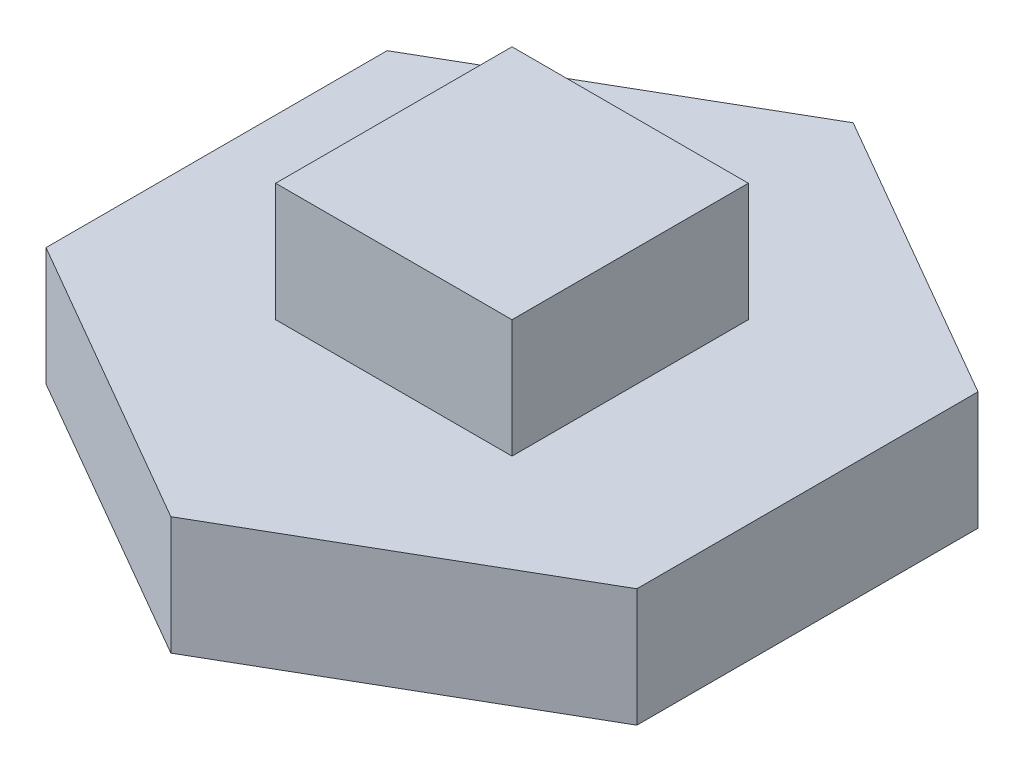
ISO-10303-21;
HEADER;
FILE_DESCRIPTION(('STEP AP214'),'2;1');
FILE_NAME('part.step','',(''),(''),'','','');
FILE_SCHEMA(('AUTOMOTIVE_DESIGN { 1 0 10303 214 1 1 1 1 }'));
ENDSEC;
DATA;
#1=APPLICATION_CONTEXT('core data for automotive mechanical design processes');
#2=APPLICATION_PROTOCOL_DEFINITION('international standard','automotive_design',2000,#1);
#3=PRODUCT_CONTEXT('',#1,'mechanical');
#4=PRODUCT('Part','Part','',(#3));
#5=PRODUCT_RELATED_PRODUCT_CATEGORY('part','',(#4));
#6=PRODUCT_DEFINITION_FORMATION('','',#4);
#7=PRODUCT_DEFINITION_CONTEXT('part definition',#1,'design');
#8=PRODUCT_DEFINITION('design','',#6,#7);
#9=PRODUCT_DEFINITION_SHAPE('','',#8);
#10=(LENGTH_UNIT() NAMED_UNIT(*) SI_UNIT(.MILLI.,.METRE.));
#11=(NAMED_UNIT(*) PLANE_ANGLE_UNIT() SI_UNIT($,.RADIAN.));
#12=(NAMED_UNIT(*) SI_UNIT($,.STERADIAN.) SOLID_ANGLE_UNIT());
#13=UNCERTAINTY_MEASURE_WITH_UNIT(LENGTH_MEASURE(1.E-05),#10,'distance_accuracy_value','');
#14=(GEOMETRIC_REPRESENTATION_CONTEXT(3) GLOBAL_UNCERTAINTY_ASSIGNED_CONTEXT((#13)) GLOBAL_UNIT_ASSIGNED_CONTEXT((#10,
#11,#12)) REPRESENTATION_CONTEXT('',''));
#15=CARTESIAN_POINT('',(0.,0.,0.));
#16=DIRECTION('',(0.,0.,1.));
#17=DIRECTION('',(1.,0.,0.));
#18=AXIS2_PLACEMENT_3D('',#15,#16,#17);
#19=CARTESIAN_POINT('',(25.0000000000003,10.,14.4337567297404));
#20=DIRECTION('',(-1.,0.,0.));
#21=DIRECTION('',(0.,0.,1.));
#22=AXIS2_PLACEMENT_3D('',#19,#20,#21);
#23=PLANE('',#22);
#24=DIRECTION('',(0.,0.,-1.));
#25=VECTOR('',#24,1.);
#26=CARTESIAN_POINT('',(25.0000000000003,0.,14.4337567297404));
#27=LINE('',#26,#25);
#28=CARTESIAN_POINT('',(25.0000000000003,0.,14.4337567297404));
#29=VERTEX_POINT('',#28);
#30=CARTESIAN_POINT('',(25.0000000000001,0.,-14.4337567297407));
#31=VERTEX_POINT('',#30);
#32=EDGE_CURVE('E139',#29,#31,#27,.T.);
#33=ORIENTED_EDGE('',*,*,#32,.T.);
#34=DIRECTION('',(0.,-1.,0.));
#35=VECTOR('',#34,1.);
#36=CARTESIAN_POINT('',(25.0000000000001,10.,-14.4337567297407));
#37=LINE('',#36,#35);
#38=CARTESIAN_POINT('',(25.0000000000001,10.,-14.4337567297407));
#39=VERTEX_POINT('',#38);
#40=EDGE_CURVE('E11',#39,#31,#37,.T.);
#41=ORIENTED_EDGE('',*,*,#40,.F.);
#42=DIRECTION('',(0.,0.,-1.));
#43=VECTOR('',#42,1.);
#44=CARTESIAN_POINT('',(25.0000000000003,10.,14.4337567297404));
#45=LINE('',#44,#43);
#46=CARTESIAN_POINT('',(25.0000000000003,10.,14.4337567297404));
#47=VERTEX_POINT('',#46);
#48=EDGE_CURVE('E150',#47,#39,#45,.T.);
#49=ORIENTED_EDGE('',*,*,#48,.F.);
#50=DIRECTION('',(0.,-1.,0.));
#51=VECTOR('',#50,1.);
#52=CARTESIAN_POINT('',(25.0000000000003,10.,14.4337567297404));
#53=LINE('',#52,#51);
#54=EDGE_CURVE('E169',#47,#29,#53,.T.);
#55=ORIENTED_EDGE('',*,*,#54,.T.);
#56=EDGE_LOOP('',(#33,#41,#49,#55));
#57=FACE_BOUND('',#56,.T.);
#58=ADVANCED_FACE('F39',(#57),#23,.F.);
#59=CARTESIAN_POINT('',(25.0000000000001,10.,-14.4337567297407));
#60=DIRECTION('',(-0.499999999999999,0.,0.866025403784439));
#61=DIRECTION('',(0.866025403784439,0.,0.499999999999999));
#62=AXIS2_PLACEMENT_3D('',#59,#60,#61);
#63=PLANE('',#62);
#64=DIRECTION('',(-0.866025403784439,0.,-0.499999999999999));
#65=VECTOR('',#64,1.);
#66=CARTESIAN_POINT('',(25.0000000000001,0.,-14.4337567297407));
#67=LINE('',#66,#65);
#68=CARTESIAN_POINT('',(0.,0.,-28.8675134594814));
#69=VERTEX_POINT('',#68);
#70=EDGE_CURVE('E144',#31,#69,#67,.T.);
#71=ORIENTED_EDGE('',*,*,#70,.T.);
#72=DIRECTION('',(0.,-1.,0.));
#73=VECTOR('',#72,1.);
#74=CARTESIAN_POINT('',(0.,10.,-28.8675134594814));
#75=LINE('',#74,#73);
#76=CARTESIAN_POINT('',(0.,10.,-28.8675134594814));
#77=VERTEX_POINT('',#76);
#78=EDGE_CURVE('E47',#77,#69,#75,.T.);
#79=ORIENTED_EDGE('',*,*,#78,.F.);
#80=DIRECTION('',(-0.866025403784439,0.,-0.499999999999999));
#81=VECTOR('',#80,1.);
#82=CARTESIAN_POINT('',(25.0000000000001,10.,-14.4337567297407));
#83=LINE('',#82,#81);
#84=EDGE_CURVE('E154',#39,#77,#83,.T.);
#85=ORIENTED_EDGE('',*,*,#84,.F.);
#86=ORIENTED_EDGE('',*,*,#40,.T.);
#87=EDGE_LOOP('',(#71,#79,#85,#86));
#88=FACE_BOUND('',#87,.T.);
#89=ADVANCED_FACE('F227',(#88),#63,.F.);
#90=CARTESIAN_POINT('',(0.,10.,-28.8675134594814));
#91=DIRECTION('',(0.500000000000003,0.,0.866025403784437));
#92=DIRECTION('',(0.866025403784437,0.,-0.500000000000003));
#93=AXIS2_PLACEMENT_3D('',#90,#91,#92);
#94=PLANE('',#93);
#95=DIRECTION('',(-0.866025403784437,0.,0.500000000000003));
#96=VECTOR('',#95,1.);
#97=CARTESIAN_POINT('',(0.,0.,-28.8675134594814));
#98=LINE('',#97,#96);
#99=CARTESIAN_POINT('',(-25.0000000000002,0.,-14.4337567297406));
#100=VERTEX_POINT('',#99);
#101=EDGE_CURVE('E173',#69,#100,#98,.T.);
#102=ORIENTED_EDGE('',*,*,#101,.T.);
#103=DIRECTION('',(0.,-1.,0.));
#104=VECTOR('',#103,1.);
#105=CARTESIAN_POINT('',(-25.0000000000002,10.,-14.4337567297406));
#106=LINE('',#105,#104);
#107=CARTESIAN_POINT('',(-25.0000000000002,10.,-14.4337567297406));
#108=VERTEX_POINT('',#107);
#109=EDGE_CURVE('E195',#108,#100,#106,.T.);
#110=ORIENTED_EDGE('',*,*,#109,.F.);
#111=DIRECTION('',(-0.866025403784437,0.,0.500000000000003));
#112=VECTOR('',#111,1.);
#113=CARTESIAN_POINT('',(0.,10.,-28.8675134594814));
#114=LINE('',#113,#112);
#115=EDGE_CURVE('E158',#77,#108,#114,.T.);
#116=ORIENTED_EDGE('',*,*,#115,.F.);
#117=ORIENTED_EDGE('',*,*,#78,.T.);
#118=EDGE_LOOP('',(#102,#110,#116,#117));
#119=FACE_BOUND('',#118,.T.);
#120=ADVANCED_FACE('F204',(#119),#94,.F.);
#121=CARTESIAN_POINT('',(-25.0000000000002,10.,-14.4337567297406));
#122=DIRECTION('',(1.,0.,0.));
#123=DIRECTION('',(0.,0.,-1.));
#124=AXIS2_PLACEMENT_3D('',#121,#122,#123);
#125=PLANE('',#124);
#126=DIRECTION('',(0.,0.,1.));
#127=VECTOR('',#126,1.);
#128=CARTESIAN_POINT('',(-25.0000000000002,0.,-14.4337567297406));
#129=LINE('',#128,#127);
#130=CARTESIAN_POINT('',(-25.,0.,14.4337567297409));
#131=VERTEX_POINT('',#130);
#132=EDGE_CURVE('E176',#100,#131,#129,.T.);
#133=ORIENTED_EDGE('',*,*,#132,.T.);
#134=DIRECTION('',(0.,-1.,0.));
#135=VECTOR('',#134,1.);
#136=CARTESIAN_POINT('',(-25.,10.,14.4337567297409));
#137=LINE('',#136,#135);
#138=CARTESIAN_POINT('',(-25.,10.,14.4337567297409));
#139=VERTEX_POINT('',#138);
#140=EDGE_CURVE('E191',#139,#131,#137,.T.);
#141=ORIENTED_EDGE('',*,*,#140,.F.);
#142=DIRECTION('',(0.,0.,1.));
#143=VECTOR('',#142,1.);
#144=CARTESIAN_POINT('',(-25.0000000000002,10.,-14.4337567297406));
#145=LINE('',#144,#143);
#146=EDGE_CURVE('E161',#108,#139,#145,.T.);
#147=ORIENTED_EDGE('',*,*,#146,.F.);
#148=ORIENTED_EDGE('',*,*,#109,.T.);
#149=EDGE_LOOP('',(#133,#141,#147,#148));
#150=FACE_BOUND('',#149,.T.);
#151=ADVANCED_FACE('F215',(#150),#125,.F.);
#152=CARTESIAN_POINT('',(-25.,10.,14.4337567297409));
#153=DIRECTION('',(0.499999999999993,0.,-0.866025403784443));
#154=DIRECTION('',(-0.866025403784443,0.,-0.499999999999993));
#155=AXIS2_PLACEMENT_3D('',#152,#153,#154);
#156=PLANE('',#155);
#157=DIRECTION('',(0.866025403784443,0.,0.499999999999993));
#158=VECTOR('',#157,1.);
#159=CARTESIAN_POINT('',(-25.,0.,14.4337567297409));
#160=LINE('',#159,#158);
#161=CARTESIAN_POINT('',(2.68882138776405E-13,0.,28.8675134594814));
#162=VERTEX_POINT('',#161);
#163=EDGE_CURVE('E179',#131,#162,#160,.T.);
#164=ORIENTED_EDGE('',*,*,#163,.T.);
#165=DIRECTION('',(0.,-1.,0.));
#166=VECTOR('',#165,1.);
#167=CARTESIAN_POINT('',(2.68882138776405E-13,10.,28.8675134594814));
#168=LINE('',#167,#166);
#169=CARTESIAN_POINT('',(2.68882138776405E-13,10.,28.8675134594814));
#170=VERTEX_POINT('',#169);
#171=EDGE_CURVE('E187',#170,#162,#168,.T.);
#172=ORIENTED_EDGE('',*,*,#171,.F.);
#173=DIRECTION('',(0.866025403784443,0.,0.499999999999993));
#174=VECTOR('',#173,1.);
#175=CARTESIAN_POINT('',(-25.,10.,14.4337567297409));
#176=LINE('',#175,#174);
#177=EDGE_CURVE('E164',#139,#170,#176,.T.);
#178=ORIENTED_EDGE('',*,*,#177,.F.);
#179=ORIENTED_EDGE('',*,*,#140,.T.);
#180=EDGE_LOOP('',(#164,#172,#178,#179));
#181=FACE_BOUND('',#180,.T.);
#182=ADVANCED_FACE('F219',(#181),#156,.F.);
#183=CARTESIAN_POINT('',(2.68882138776405E-13,10.,28.8675134594814));
#184=DIRECTION('',(-0.500000000000009,0.,-0.866025403784433));
#185=DIRECTION('',(-0.866025403784433,0.,0.500000000000009));
#186=AXIS2_PLACEMENT_3D('',#183,#184,#185);
#187=PLANE('',#186);
#188=DIRECTION('',(0.866025403784433,0.,-0.500000000000009));
#189=VECTOR('',#188,1.);
#190=CARTESIAN_POINT('',(2.68882138776405E-13,0.,28.8675134594814));
#191=LINE('',#190,#189);
#192=EDGE_CURVE('E155',#162,#29,#191,.T.);
#193=ORIENTED_EDGE('',*,*,#192,.T.);
#194=ORIENTED_EDGE('',*,*,#54,.F.);
#195=DIRECTION('',(0.866025403784433,0.,-0.500000000000009));
#196=VECTOR('',#195,1.);
#197=CARTESIAN_POINT('',(2.68882138776405E-13,10.,28.8675134594814));
#198=LINE('',#197,#196);
#199=EDGE_CURVE('E167',#170,#47,#198,.T.);
#200=ORIENTED_EDGE('',*,*,#199,.F.);
#201=ORIENTED_EDGE('',*,*,#171,.T.);
#202=EDGE_LOOP('',(#193,#194,#200,#201));
#203=FACE_BOUND('',#202,.T.);
#204=ADVANCED_FACE('F230',(#203),#187,.F.);
#205=CARTESIAN_POINT('',(0.,10.,0.));
#206=DIRECTION('',(0.,1.,0.));
#207=DIRECTION('',(0.,0.,1.));
#208=AXIS2_PLACEMENT_3D('',#205,#206,#207);
#209=PLANE('',#208);
#210=DIRECTION('',(0.,0.,-1.));
#211=VECTOR('',#210,1.);
#212=CARTESIAN_POINT('',(10.,10.,-10.));
#213=LINE('',#212,#211);
#214=CARTESIAN_POINT('',(10.,10.,10.));
#215=VERTEX_POINT('',#214);
#216=CARTESIAN_POINT('',(10.,10.,-10.));
#217=VERTEX_POINT('',#216);
#218=EDGE_CURVE('E54',#215,#217,#213,.T.);
#219=ORIENTED_EDGE('',*,*,#218,.F.);
#220=DIRECTION('',(1.,0.,0.));
#221=VECTOR('',#220,1.);
#222=CARTESIAN_POINT('',(-10.,10.,10.));
#223=LINE('',#222,#221);
#224=CARTESIAN_POINT('',(-10.,10.,10.));
#225=VERTEX_POINT('',#224);
#226=EDGE_CURVE('E58',#225,#215,#223,.T.);
#227=ORIENTED_EDGE('',*,*,#226,.F.);
#228=DIRECTION('',(0.,0.,1.));
#229=VECTOR('',#228,1.);
#230=CARTESIAN_POINT('',(-10.,10.,-10.));
#231=LINE('',#230,#229);
#232=CARTESIAN_POINT('',(-10.,10.,-10.));
#233=VERTEX_POINT('',#232);
#234=EDGE_CURVE('E325',#233,#225,#231,.T.);
#235=ORIENTED_EDGE('',*,*,#234,.F.);
#236=DIRECTION('',(-1.,0.,0.));
#237=VECTOR('',#236,1.);
#238=CARTESIAN_POINT('',(-10.,10.,-10.));
#239=LINE('',#238,#237);
#240=EDGE_CURVE('E335',#217,#233,#239,.T.);
#241=ORIENTED_EDGE('',*,*,#240,.F.);
#242=EDGE_LOOP('',(#219,#227,#235,#241));
#243=FACE_BOUND('',#242,.T.);
#244=ORIENTED_EDGE('',*,*,#48,.T.);
#245=ORIENTED_EDGE('',*,*,#84,.T.);
#246=ORIENTED_EDGE('',*,*,#115,.T.);
#247=ORIENTED_EDGE('',*,*,#146,.T.);
#248=ORIENTED_EDGE('',*,*,#177,.T.);
#249=ORIENTED_EDGE('',*,*,#199,.T.);
#250=EDGE_LOOP('',(#244,#245,#246,#247,#248,#249));
#251=FACE_BOUND('',#250,.T.);
#252=ADVANCED_FACE('F223',(#243,#251),#209,.T.);
#253=CARTESIAN_POINT('',(0.,0.,0.));
#254=DIRECTION('',(0.,1.,0.));
#255=DIRECTION('',(0.,0.,1.));
#256=AXIS2_PLACEMENT_3D('',#253,#254,#255);
#257=PLANE('',#256);
#258=ORIENTED_EDGE('',*,*,#32,.F.);
#259=ORIENTED_EDGE('',*,*,#192,.F.);
#260=ORIENTED_EDGE('',*,*,#163,.F.);
#261=ORIENTED_EDGE('',*,*,#132,.F.);
#262=ORIENTED_EDGE('',*,*,#101,.F.);
#263=ORIENTED_EDGE('',*,*,#70,.F.);
#264=EDGE_LOOP('',(#258,#259,#260,#261,#262,#263));
#265=FACE_BOUND('',#264,.T.);
#266=ADVANCED_FACE('F210',(#265),#257,.F.);
#267=CARTESIAN_POINT('',(10.,20.,-10.));
#268=DIRECTION('',(-1.,0.,0.));
#269=DIRECTION('',(0.,0.,1.));
#270=AXIS2_PLACEMENT_3D('',#267,#268,#269);
#271=PLANE('',#270);
#272=ORIENTED_EDGE('',*,*,#218,.T.);
#273=DIRECTION('',(0.,-1.,0.));
#274=VECTOR('',#273,1.);
#275=CARTESIAN_POINT('',(10.,20.,-10.));
#276=LINE('',#275,#274);
#277=CARTESIAN_POINT('',(10.,20.,-10.));
#278=VERTEX_POINT('',#277);
#279=EDGE_CURVE('E119',#278,#217,#276,.T.);
#280=ORIENTED_EDGE('',*,*,#279,.F.);
#281=DIRECTION('',(0.,0.,-1.));
#282=VECTOR('',#281,1.);
#283=CARTESIAN_POINT('',(10.,20.,-10.));
#284=LINE('',#283,#282);
#285=CARTESIAN_POINT('',(10.,20.,10.));
#286=VERTEX_POINT('',#285);
#287=EDGE_CURVE('E126',#286,#278,#284,.T.);
#288=ORIENTED_EDGE('',*,*,#287,.F.);
#289=DIRECTION('',(0.,-1.,0.));
#290=VECTOR('',#289,1.);
#291=CARTESIAN_POINT('',(10.,20.,10.));
#292=LINE('',#291,#290);
#293=EDGE_CURVE('E322',#286,#215,#292,.T.);
#294=ORIENTED_EDGE('',*,*,#293,.T.);
#295=EDGE_LOOP('',(#272,#280,#288,#294));
#296=FACE_BOUND('',#295,.T.);
#297=ADVANCED_FACE('F137',(#296),#271,.F.);
#298=CARTESIAN_POINT('',(-10.,20.,-10.));
#299=DIRECTION('',(0.,0.,1.));
#300=DIRECTION('',(1.,0.,0.));
#301=AXIS2_PLACEMENT_3D('',#298,#299,#300);
#302=PLANE('',#301);
#303=ORIENTED_EDGE('',*,*,#240,.T.);
#304=DIRECTION('',(0.,-1.,0.));
#305=VECTOR('',#304,1.);
#306=CARTESIAN_POINT('',(-10.,20.,-10.));
#307=LINE('',#306,#305);
#308=CARTESIAN_POINT('',(-10.,20.,-10.));
#309=VERTEX_POINT('',#308);
#310=EDGE_CURVE('E121',#309,#233,#307,.T.);
#311=ORIENTED_EDGE('',*,*,#310,.F.);
#312=DIRECTION('',(-1.,0.,0.));
#313=VECTOR('',#312,1.);
#314=CARTESIAN_POINT('',(-10.,20.,-10.));
#315=LINE('',#314,#313);
#316=EDGE_CURVE('E114',#278,#309,#315,.T.);
#317=ORIENTED_EDGE('',*,*,#316,.F.);
#318=ORIENTED_EDGE('',*,*,#279,.T.);
#319=EDGE_LOOP('',(#303,#311,#317,#318));
#320=FACE_BOUND('',#319,.T.);
#321=ADVANCED_FACE('F117',(#320),#302,.F.);
#322=CARTESIAN_POINT('',(-10.,20.,-10.));
#323=DIRECTION('',(1.,0.,0.));
#324=DIRECTION('',(0.,0.,-1.));
#325=AXIS2_PLACEMENT_3D('',#322,#323,#324);
#326=PLANE('',#325);
#327=ORIENTED_EDGE('',*,*,#234,.T.);
#328=DIRECTION('',(0.,-1.,0.));
#329=VECTOR('',#328,1.);
#330=CARTESIAN_POINT('',(-10.,20.,10.));
#331=LINE('',#330,#329);
#332=CARTESIAN_POINT('',(-10.,20.,10.));
#333=VERTEX_POINT('',#332);
#334=EDGE_CURVE('E146',#333,#225,#331,.T.);
#335=ORIENTED_EDGE('',*,*,#334,.F.);
#336=DIRECTION('',(0.,0.,1.));
#337=VECTOR('',#336,1.);
#338=CARTESIAN_POINT('',(-10.,20.,-10.));
#339=LINE('',#338,#337);
#340=EDGE_CURVE('E125',#309,#333,#339,.T.);
#341=ORIENTED_EDGE('',*,*,#340,.F.);
#342=ORIENTED_EDGE('',*,*,#310,.T.);
#343=EDGE_LOOP('',(#327,#335,#341,#342));
#344=FACE_BOUND('',#343,.T.);
#345=ADVANCED_FACE('F290',(#344),#326,.F.);
#346=CARTESIAN_POINT('',(-10.,20.,10.));
#347=DIRECTION('',(0.,0.,-1.));
#348=DIRECTION('',(-1.,0.,0.));
#349=AXIS2_PLACEMENT_3D('',#346,#347,#348);
#350=PLANE('',#349);
#351=ORIENTED_EDGE('',*,*,#226,.T.);
#352=ORIENTED_EDGE('',*,*,#293,.F.);
#353=DIRECTION('',(1.,0.,0.));
#354=VECTOR('',#353,1.);
#355=CARTESIAN_POINT('',(-10.,20.,10.));
#356=LINE('',#355,#354);
#357=EDGE_CURVE('E131',#333,#286,#356,.T.);
#358=ORIENTED_EDGE('',*,*,#357,.F.);
#359=ORIENTED_EDGE('',*,*,#334,.T.);
#360=EDGE_LOOP('',(#351,#352,#358,#359));
#361=FACE_BOUND('',#360,.T.);
#362=ADVANCED_FACE('F299',(#361),#350,.F.);
#363=CARTESIAN_POINT('',(0.,20.,0.));
#364=DIRECTION('',(0.,1.,0.));
#365=DIRECTION('',(0.,0.,1.));
#366=AXIS2_PLACEMENT_3D('',#363,#364,#365);
#367=PLANE('',#366);
#368=ORIENTED_EDGE('',*,*,#287,.T.);
#369=ORIENTED_EDGE('',*,*,#316,.T.);
#370=ORIENTED_EDGE('',*,*,#340,.T.);
#371=ORIENTED_EDGE('',*,*,#357,.T.);
#372=EDGE_LOOP('',(#368,#369,#370,#371));
#373=FACE_BOUND('',#372,.T.);
#374=ADVANCED_FACE('F129',(#373),#367,.T.);
#375=CLOSED_SHELL('',(#58,#89,#120,#151,#182,#204,#252,#266,#297,#321,#345,#362,#374));
#376=MANIFOLD_SOLID_BREP('B2',#375);
#377=ADVANCED_BREP_SHAPE_REPRESENTATION('',(#18,#376),#14);
#378=SHAPE_DEFINITION_REPRESENTATION(#9,#377);
ENDSEC;
END-ISO-10303-21;
